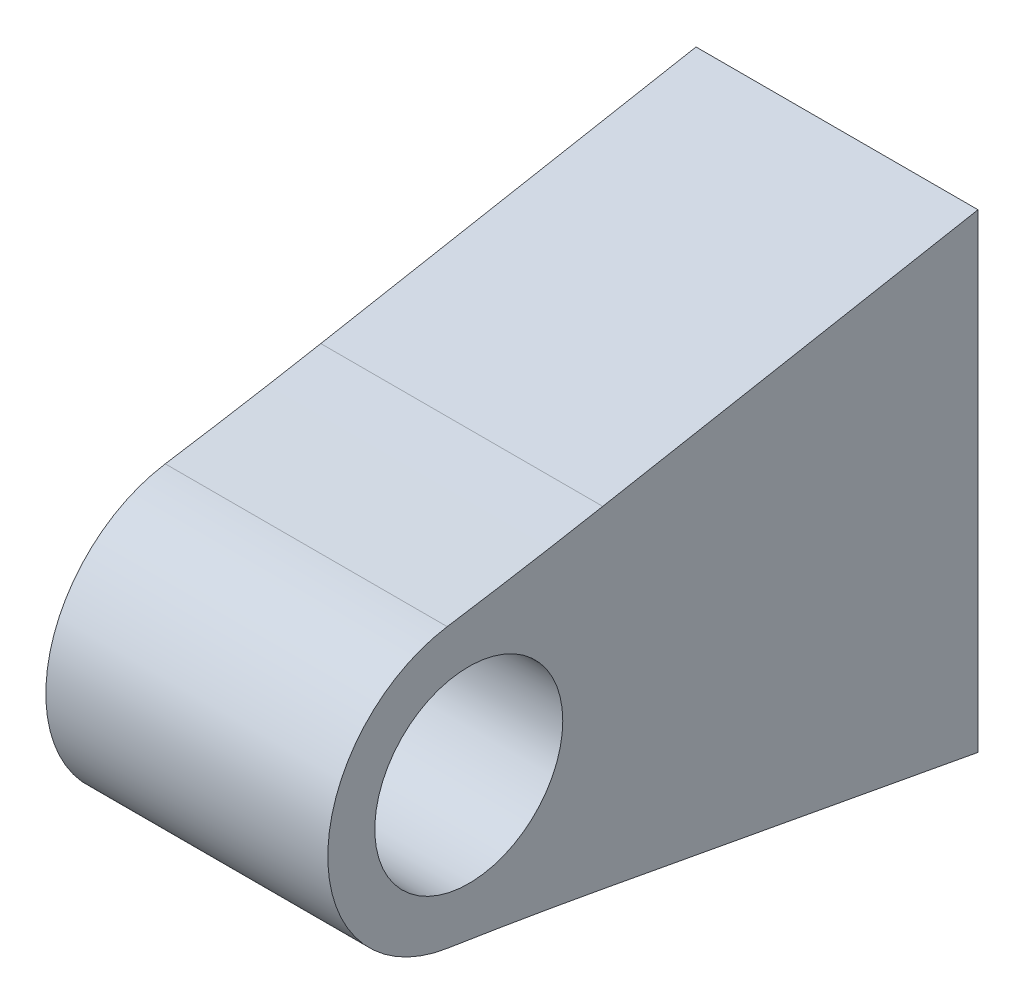
ISO-10303-21;
HEADER;
FILE_DESCRIPTION(('STEP AP214'),'2;1');
FILE_NAME('part.step','',(''),(''),'','','');
FILE_SCHEMA(('AUTOMOTIVE_DESIGN { 1 0 10303 214 1 1 1 1 }'));
ENDSEC;
DATA;
#1=APPLICATION_CONTEXT('core data for automotive mechanical design processes');
#2=APPLICATION_PROTOCOL_DEFINITION('international standard','automotive_design',2000,#1);
#3=PRODUCT_CONTEXT('',#1,'mechanical');
#4=PRODUCT('Part','Part','',(#3));
#5=PRODUCT_RELATED_PRODUCT_CATEGORY('part','',(#4));
#6=PRODUCT_DEFINITION_FORMATION('','',#4);
#7=PRODUCT_DEFINITION_CONTEXT('part definition',#1,'design');
#8=PRODUCT_DEFINITION('design','',#6,#7);
#9=PRODUCT_DEFINITION_SHAPE('','',#8);
#10=(LENGTH_UNIT() NAMED_UNIT(*) SI_UNIT(.MILLI.,.METRE.));
#11=(NAMED_UNIT(*) PLANE_ANGLE_UNIT() SI_UNIT($,.RADIAN.));
#12=(NAMED_UNIT(*) SI_UNIT($,.STERADIAN.) SOLID_ANGLE_UNIT());
#13=UNCERTAINTY_MEASURE_WITH_UNIT(LENGTH_MEASURE(1.E-05),#10,'distance_accuracy_value','');
#14=(GEOMETRIC_REPRESENTATION_CONTEXT(3) GLOBAL_UNCERTAINTY_ASSIGNED_CONTEXT((#13)) GLOBAL_UNIT_ASSIGNED_CONTEXT((#10,
#11,#12)) REPRESENTATION_CONTEXT('',''));
#15=CARTESIAN_POINT('',(0.,0.,0.));
#16=DIRECTION('',(0.,0.,1.));
#17=DIRECTION('',(1.,0.,0.));
#18=AXIS2_PLACEMENT_3D('',#15,#16,#17);
#19=CARTESIAN_POINT('',(15.,0.,4.22155688622755));
#20=DIRECTION('',(1.,0.,0.));
#21=DIRECTION('',(0.,0.,-1.));
#22=AXIS2_PLACEMENT_3D('',#19,#20,#21);
#23=PLANE('',#22);
#24=CARTESIAN_POINT('',(15.,0.,4.22155688622755));
#25=DIRECTION('',(1.,0.,0.));
#26=DIRECTION('',(0.,0.,-1.));
#27=AXIS2_PLACEMENT_3D('',#24,#25,#26);
#28=CIRCLE('',#27,7.5);
#29=CARTESIAN_POINT('',(15.,7.4117187197087,5.36891281178843));
#30=VERTEX_POINT('',#29);
#31=CARTESIAN_POINT('',(15.,-7.4117187197087,5.36891281178843));
#32=VERTEX_POINT('',#31);
#33=EDGE_CURVE('E127',#30,#32,#28,.T.);
#34=ORIENTED_EDGE('',*,*,#33,.T.);
#35=CARTESIAN_POINT('',(15.,-293.998175881778,49.7333419334756));
#36=DIRECTION('',(1.,0.,0.));
#37=DIRECTION('',(0.,0.,-1.));
#38=AXIS2_PLACEMENT_3D('',#35,#36,#37);
#39=CIRCLE('',#38,290.);
#40=CARTESIAN_POINT('',(15.,-8.81553425011609,-2.90562568545551));
#41=VERTEX_POINT('',#40);
#42=EDGE_CURVE('E99',#32,#41,#39,.F.);
#43=ORIENTED_EDGE('',*,*,#42,.T.);
#44=DIRECTION('',(0.,-0.18151368144459,-0.983388419419525));
#45=VECTOR('',#44,1.);
#46=CARTESIAN_POINT('',(15.,-12.5,-22.86699124946));
#47=LINE('',#46,#45);
#48=CARTESIAN_POINT('',(15.,-12.5,-22.86699124946));
#49=VERTEX_POINT('',#48);
#50=EDGE_CURVE('E92',#41,#49,#47,.T.);
#51=ORIENTED_EDGE('',*,*,#50,.T.);
#52=DIRECTION('',(0.,1.,0.));
#53=VECTOR('',#52,1.);
#54=CARTESIAN_POINT('',(15.,12.5,-22.86699124946));
#55=LINE('',#54,#53);
#56=CARTESIAN_POINT('',(15.,12.5,-22.86699124946));
#57=VERTEX_POINT('',#56);
#58=EDGE_CURVE('E96',#49,#57,#55,.T.);
#59=ORIENTED_EDGE('',*,*,#58,.T.);
#60=DIRECTION('',(0.,-0.18151368144459,0.983388419419525));
#61=VECTOR('',#60,1.);
#62=CARTESIAN_POINT('',(15.,7.5,4.22155688622755));
#63=LINE('',#62,#61);
#64=CARTESIAN_POINT('',(15.,8.81553425011609,-2.90562568545551));
#65=VERTEX_POINT('',#64);
#66=EDGE_CURVE('E114',#57,#65,#63,.T.);
#67=ORIENTED_EDGE('',*,*,#66,.T.);
#68=CARTESIAN_POINT('',(15.,293.998175881778,49.7333419334756));
#69=DIRECTION('',(1.,0.,0.));
#70=DIRECTION('',(0.,0.,-1.));
#71=AXIS2_PLACEMENT_3D('',#68,#69,#70);
#72=CIRCLE('',#71,290.);
#73=EDGE_CURVE('E11',#65,#30,#72,.F.);
#74=ORIENTED_EDGE('',*,*,#73,.T.);
#75=EDGE_LOOP('',(#34,#43,#51,#59,#67,#74));
#76=FACE_BOUND('',#75,.T.);
#77=CARTESIAN_POINT('',(15.,0.,4.22155688622755));
#78=DIRECTION('',(1.,0.,0.));
#79=DIRECTION('',(0.,0.,-1.));
#80=AXIS2_PLACEMENT_3D('',#77,#78,#79);
#81=CIRCLE('',#80,5.);
#82=CARTESIAN_POINT('',(15.,0.,-0.778443113772449));
#83=VERTEX_POINT('',#82);
#84=EDGE_CURVE('E261',#83,#83,#81,.T.);
#85=ORIENTED_EDGE('',*,*,#84,.F.);
#86=EDGE_LOOP('',(#85));
#87=FACE_BOUND('',#86,.T.);
#88=ADVANCED_FACE('F39',(#76,#87),#23,.T.);
#89=CARTESIAN_POINT('',(0.,0.,4.22155688622755));
#90=DIRECTION('',(1.,0.,0.));
#91=DIRECTION('',(0.,0.,-1.));
#92=AXIS2_PLACEMENT_3D('',#89,#90,#91);
#93=PLANE('',#92);
#94=DIRECTION('',(0.,-0.18151368144459,-0.983388419419525));
#95=VECTOR('',#94,1.);
#96=CARTESIAN_POINT('',(0.,-12.5,-22.86699124946));
#97=LINE('',#96,#95);
#98=CARTESIAN_POINT('',(0.,-8.81553425011609,-2.90562568545551));
#99=VERTEX_POINT('',#98);
#100=CARTESIAN_POINT('',(0.,-12.5,-22.86699124946));
#101=VERTEX_POINT('',#100);
#102=EDGE_CURVE('E118',#99,#101,#97,.T.);
#103=ORIENTED_EDGE('',*,*,#102,.F.);
#104=CARTESIAN_POINT('',(0.,-293.998175881778,49.7333419334756));
#105=DIRECTION('',(1.,0.,0.));
#106=DIRECTION('',(0.,0.,-1.));
#107=AXIS2_PLACEMENT_3D('',#104,#105,#106);
#108=CIRCLE('',#107,290.);
#109=CARTESIAN_POINT('',(0.,-7.4117187197087,5.36891281178843));
#110=VERTEX_POINT('',#109);
#111=EDGE_CURVE('E139',#99,#110,#108,.T.);
#112=ORIENTED_EDGE('',*,*,#111,.T.);
#113=CARTESIAN_POINT('',(0.,0.,4.22155688622755));
#114=DIRECTION('',(1.,0.,0.));
#115=DIRECTION('',(0.,0.,-1.));
#116=AXIS2_PLACEMENT_3D('',#113,#114,#115);
#117=CIRCLE('',#116,7.5);
#118=CARTESIAN_POINT('',(0.,7.4117187197087,5.36891281178843));
#119=VERTEX_POINT('',#118);
#120=EDGE_CURVE('E105',#119,#110,#117,.T.);
#121=ORIENTED_EDGE('',*,*,#120,.F.);
#122=CARTESIAN_POINT('',(0.,293.998175881778,49.7333419334756));
#123=DIRECTION('',(1.,0.,0.));
#124=DIRECTION('',(0.,0.,-1.));
#125=AXIS2_PLACEMENT_3D('',#122,#123,#124);
#126=CIRCLE('',#125,290.);
#127=CARTESIAN_POINT('',(0.,8.81553425011609,-2.90562568545551));
#128=VERTEX_POINT('',#127);
#129=EDGE_CURVE('E48',#119,#128,#126,.T.);
#130=ORIENTED_EDGE('',*,*,#129,.T.);
#131=DIRECTION('',(0.,-0.18151368144459,0.983388419419525));
#132=VECTOR('',#131,1.);
#133=CARTESIAN_POINT('',(0.,7.5,4.22155688622755));
#134=LINE('',#133,#132);
#135=CARTESIAN_POINT('',(0.,12.5,-22.86699124946));
#136=VERTEX_POINT('',#135);
#137=EDGE_CURVE('E154',#136,#128,#134,.T.);
#138=ORIENTED_EDGE('',*,*,#137,.F.);
#139=DIRECTION('',(0.,1.,0.));
#140=VECTOR('',#139,1.);
#141=CARTESIAN_POINT('',(0.,12.5,-22.86699124946));
#142=LINE('',#141,#140);
#143=EDGE_CURVE('E275',#101,#136,#142,.T.);
#144=ORIENTED_EDGE('',*,*,#143,.F.);
#145=EDGE_LOOP('',(#103,#112,#121,#130,#138,#144));
#146=FACE_BOUND('',#145,.T.);
#147=CARTESIAN_POINT('',(0.,0.,4.22155688622755));
#148=DIRECTION('',(1.,0.,0.));
#149=DIRECTION('',(0.,0.,-1.));
#150=AXIS2_PLACEMENT_3D('',#147,#148,#149);
#151=CIRCLE('',#150,5.);
#152=CARTESIAN_POINT('',(0.,0.,-0.778443113772449));
#153=VERTEX_POINT('',#152);
#154=EDGE_CURVE('E255',#153,#153,#151,.T.);
#155=ORIENTED_EDGE('',*,*,#154,.T.);
#156=EDGE_LOOP('',(#155));
#157=FACE_BOUND('',#156,.T.);
#158=ADVANCED_FACE('F145',(#146,#157),#93,.F.);
#159=CARTESIAN_POINT('',(15.,-12.5,-22.86699124946));
#160=DIRECTION('',(0.,0.983388419419525,-0.18151368144459));
#161=DIRECTION('',(0.,0.18151368144459,0.983388419419525));
#162=AXIS2_PLACEMENT_3D('',#159,#160,#161);
#163=PLANE('',#162);
#164=ORIENTED_EDGE('',*,*,#50,.F.);
#165=DIRECTION('',(1.,0.,0.));
#166=VECTOR('',#165,1.);
#167=CARTESIAN_POINT('',(0.,-8.81553425011605,-2.90562568545552));
#168=LINE('',#167,#166);
#169=EDGE_CURVE('E121',#41,#99,#168,.F.);
#170=ORIENTED_EDGE('',*,*,#169,.T.);
#171=ORIENTED_EDGE('',*,*,#102,.T.);
#172=DIRECTION('',(-1.,0.,0.));
#173=VECTOR('',#172,1.);
#174=CARTESIAN_POINT('',(15.,-12.5,-22.86699124946));
#175=LINE('',#174,#173);
#176=EDGE_CURVE('E110',#49,#101,#175,.T.);
#177=ORIENTED_EDGE('',*,*,#176,.F.);
#178=EDGE_LOOP('',(#164,#170,#171,#177));
#179=FACE_BOUND('',#178,.T.);
#180=ADVANCED_FACE('F116',(#179),#163,.F.);
#181=CARTESIAN_POINT('',(15.,12.5,-22.86699124946));
#182=DIRECTION('',(0.,0.,1.));
#183=DIRECTION('',(1.,0.,0.));
#184=AXIS2_PLACEMENT_3D('',#181,#182,#183);
#185=PLANE('',#184);
#186=CARTESIAN_POINT('',(7.5,0.,-22.86699124946));
#187=DIRECTION('',(0.,0.,-1.));
#188=DIRECTION('',(-1.,0.,0.));
#189=AXIS2_PLACEMENT_3D('',#186,#187,#188);
#190=CIRCLE('',#189,2.5);
#191=CARTESIAN_POINT('',(5.,0.,-22.86699124946));
#192=VERTEX_POINT('',#191);
#193=EDGE_CURVE('E256',#192,#192,#190,.T.);
#194=ORIENTED_EDGE('',*,*,#193,.F.);
#195=EDGE_LOOP('',(#194));
#196=FACE_BOUND('',#195,.T.);
#197=ORIENTED_EDGE('',*,*,#143,.T.);
#198=DIRECTION('',(-1.,0.,0.));
#199=VECTOR('',#198,1.);
#200=CARTESIAN_POINT('',(15.,12.5,-22.86699124946));
#201=LINE('',#200,#199);
#202=EDGE_CURVE('E112',#57,#136,#201,.T.);
#203=ORIENTED_EDGE('',*,*,#202,.F.);
#204=ORIENTED_EDGE('',*,*,#58,.F.);
#205=ORIENTED_EDGE('',*,*,#176,.T.);
#206=EDGE_LOOP('',(#197,#203,#204,#205));
#207=FACE_BOUND('',#206,.T.);
#208=ADVANCED_FACE('F109',(#196,#207),#185,.F.);
#209=CARTESIAN_POINT('',(15.,7.5,4.22155688622755));
#210=DIRECTION('',(0.,-0.983388419419525,-0.18151368144459));
#211=DIRECTION('',(0.,0.18151368144459,-0.983388419419525));
#212=AXIS2_PLACEMENT_3D('',#209,#210,#211);
#213=PLANE('',#212);
#214=ORIENTED_EDGE('',*,*,#137,.T.);
#215=DIRECTION('',(1.,0.,0.));
#216=VECTOR('',#215,1.);
#217=CARTESIAN_POINT('',(15.,8.81553425011611,-2.90562568545551));
#218=LINE('',#217,#216);
#219=EDGE_CURVE('E55',#128,#65,#218,.T.);
#220=ORIENTED_EDGE('',*,*,#219,.T.);
#221=ORIENTED_EDGE('',*,*,#66,.F.);
#222=ORIENTED_EDGE('',*,*,#202,.T.);
#223=EDGE_LOOP('',(#214,#220,#221,#222));
#224=FACE_BOUND('',#223,.T.);
#225=ADVANCED_FACE('F177',(#224),#213,.F.);
#226=CARTESIAN_POINT('',(15.,0.,4.22155688622755));
#227=DIRECTION('',(-1.,0.,0.));
#228=DIRECTION('',(0.,0.,1.));
#229=AXIS2_PLACEMENT_3D('',#226,#227,#228);
#230=CYLINDRICAL_SURFACE('',#229,7.5);
#231=ORIENTED_EDGE('',*,*,#120,.T.);
#232=DIRECTION('',(-1.,0.,0.));
#233=VECTOR('',#232,1.);
#234=CARTESIAN_POINT('',(15.,-7.4117187197087,5.36891281178843));
#235=LINE('',#234,#233);
#236=EDGE_CURVE('E134',#110,#32,#235,.F.);
#237=ORIENTED_EDGE('',*,*,#236,.T.);
#238=ORIENTED_EDGE('',*,*,#33,.F.);
#239=DIRECTION('',(-1.,0.,0.));
#240=VECTOR('',#239,1.);
#241=CARTESIAN_POINT('',(15.,7.4117187197087,5.36891281178843));
#242=LINE('',#241,#240);
#243=EDGE_CURVE('E125',#30,#119,#242,.T.);
#244=ORIENTED_EDGE('',*,*,#243,.T.);
#245=EDGE_LOOP('',(#231,#237,#238,#244));
#246=FACE_BOUND('',#245,.T.);
#247=ADVANCED_FACE('F150',(#246),#230,.T.);
#248=CARTESIAN_POINT('',(15.,0.,4.22155688622755));
#249=DIRECTION('',(-1.,0.,0.));
#250=DIRECTION('',(0.,0.,1.));
#251=AXIS2_PLACEMENT_3D('',#248,#249,#250);
#252=CYLINDRICAL_SURFACE('',#251,5.);
#253=ORIENTED_EDGE('',*,*,#84,.T.);
#254=EDGE_LOOP('',(#253));
#255=FACE_BOUND('',#254,.T.);
#256=ORIENTED_EDGE('',*,*,#154,.F.);
#257=EDGE_LOOP('',(#256));
#258=FACE_BOUND('',#257,.T.);
#259=ADVANCED_FACE('F157',(#255,#258),#252,.F.);
#260=CARTESIAN_POINT('',(15.,-293.998175881778,49.7333419334756));
#261=DIRECTION('',(-1.,0.,0.));
#262=DIRECTION('',(0.,0.,1.));
#263=AXIS2_PLACEMENT_3D('',#260,#261,#262);
#264=CYLINDRICAL_SURFACE('',#263,290.);
#265=ORIENTED_EDGE('',*,*,#42,.F.);
#266=ORIENTED_EDGE('',*,*,#236,.F.);
#267=ORIENTED_EDGE('',*,*,#111,.F.);
#268=ORIENTED_EDGE('',*,*,#169,.F.);
#269=EDGE_LOOP('',(#265,#266,#267,#268));
#270=FACE_BOUND('',#269,.T.);
#271=ADVANCED_FACE('F155',(#270),#264,.F.);
#272=CARTESIAN_POINT('',(15.,293.998175881778,49.7333419334756));
#273=DIRECTION('',(-1.,0.,0.));
#274=DIRECTION('',(0.,0.,1.));
#275=AXIS2_PLACEMENT_3D('',#272,#273,#274);
#276=CYLINDRICAL_SURFACE('',#275,290.);
#277=ORIENTED_EDGE('',*,*,#73,.F.);
#278=ORIENTED_EDGE('',*,*,#219,.F.);
#279=ORIENTED_EDGE('',*,*,#129,.F.);
#280=ORIENTED_EDGE('',*,*,#243,.F.);
#281=EDGE_LOOP('',(#277,#278,#279,#280));
#282=FACE_BOUND('',#281,.T.);
#283=ADVANCED_FACE('F41',(#282),#276,.F.);
#284=CARTESIAN_POINT('',(7.5,0.,-17.86699124946));
#285=DIRECTION('',(0.,0.,-1.));
#286=DIRECTION('',(-1.,0.,0.));
#287=AXIS2_PLACEMENT_3D('',#284,#285,#286);
#288=CYLINDRICAL_SURFACE('',#287,2.5);
#289=CARTESIAN_POINT('',(7.5,0.,-17.86699124946));
#290=DIRECTION('',(0.,0.,-1.));
#291=DIRECTION('',(-1.,0.,0.));
#292=AXIS2_PLACEMENT_3D('',#289,#290,#291);
#293=CIRCLE('',#292,2.5);
#294=CARTESIAN_POINT('',(5.,0.,-17.86699124946));
#295=VERTEX_POINT('',#294);
#296=EDGE_CURVE('E253',#295,#295,#293,.T.);
#297=ORIENTED_EDGE('',*,*,#296,.F.);
#298=EDGE_LOOP('',(#297));
#299=FACE_BOUND('',#298,.T.);
#300=ORIENTED_EDGE('',*,*,#193,.T.);
#301=EDGE_LOOP('',(#300));
#302=FACE_BOUND('',#301,.T.);
#303=ADVANCED_FACE('F162',(#299,#302),#288,.F.);
#304=CARTESIAN_POINT('',(7.5,0.,-17.86699124946));
#305=DIRECTION('',(0.,0.,-1.));
#306=DIRECTION('',(-1.,0.,0.));
#307=AXIS2_PLACEMENT_3D('',#304,#305,#306);
#308=PLANE('',#307);
#309=ORIENTED_EDGE('',*,*,#296,.T.);
#310=EDGE_LOOP('',(#309));
#311=FACE_BOUND('',#310,.T.);
#312=ADVANCED_FACE('F238',(#311),#308,.T.);
#313=CLOSED_SHELL('',(#88,#158,#180,#208,#225,#247,#259,#271,#283,#303,#312));
#314=MANIFOLD_SOLID_BREP('B2',#313);
#315=ADVANCED_BREP_SHAPE_REPRESENTATION('',(#18,#314),#14);
#316=SHAPE_DEFINITION_REPRESENTATION(#9,#315);
ENDSEC;
END-ISO-10303-21;
